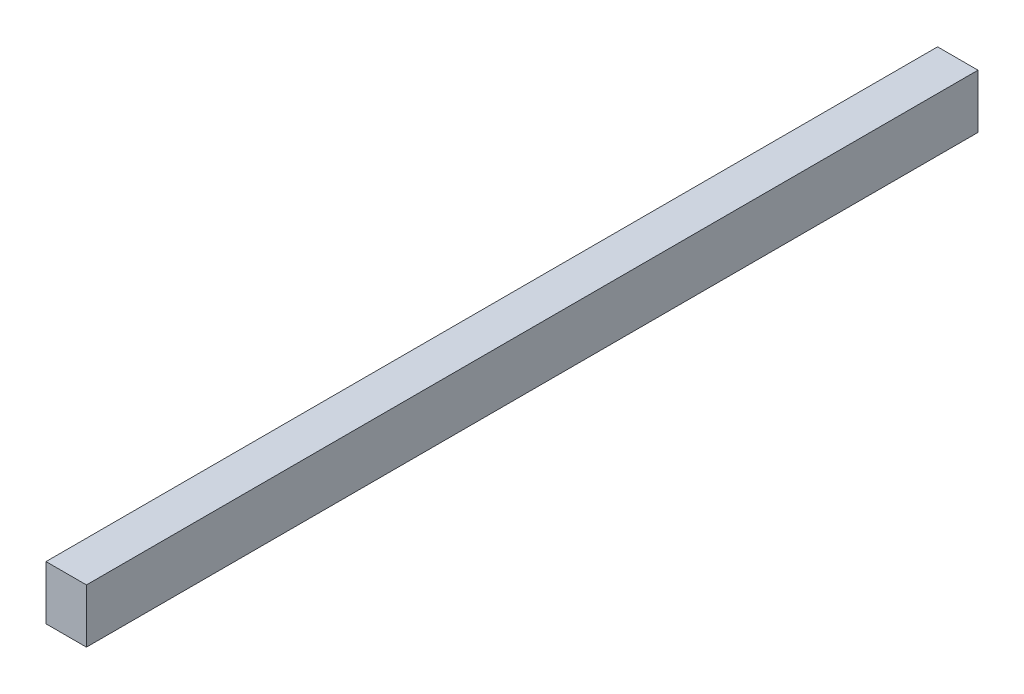
ISO-10303-21;
HEADER;
FILE_DESCRIPTION(('STEP AP214'),'2;1');
FILE_NAME('part.step','',(''),(''),'','','');
FILE_SCHEMA(('AUTOMOTIVE_DESIGN { 1 0 10303 214 1 1 1 1 }'));
ENDSEC;
DATA;
#1=APPLICATION_CONTEXT('core data for automotive mechanical design processes');
#2=APPLICATION_PROTOCOL_DEFINITION('international standard','automotive_design',2000,#1);
#3=PRODUCT_CONTEXT('',#1,'mechanical');
#4=PRODUCT('Part','Part','',(#3));
#5=PRODUCT_RELATED_PRODUCT_CATEGORY('part','',(#4));
#6=PRODUCT_DEFINITION_FORMATION('','',#4);
#7=PRODUCT_DEFINITION_CONTEXT('part definition',#1,'design');
#8=PRODUCT_DEFINITION('design','',#6,#7);
#9=PRODUCT_DEFINITION_SHAPE('','',#8);
#10=(LENGTH_UNIT() NAMED_UNIT(*) SI_UNIT(.MILLI.,.METRE.));
#11=(NAMED_UNIT(*) PLANE_ANGLE_UNIT() SI_UNIT($,.RADIAN.));
#12=(NAMED_UNIT(*) SI_UNIT($,.STERADIAN.) SOLID_ANGLE_UNIT());
#13=UNCERTAINTY_MEASURE_WITH_UNIT(LENGTH_MEASURE(1.E-05),#10,'distance_accuracy_value','');
#14=(GEOMETRIC_REPRESENTATION_CONTEXT(3) GLOBAL_UNCERTAINTY_ASSIGNED_CONTEXT((#13)) GLOBAL_UNIT_ASSIGNED_CONTEXT((#10,
#11,#12)) REPRESENTATION_CONTEXT('',''));
#15=CARTESIAN_POINT('',(0.,0.,0.));
#16=DIRECTION('',(0.,0.,1.));
#17=DIRECTION('',(1.,0.,0.));
#18=AXIS2_PLACEMENT_3D('',#15,#16,#17);
#19=CARTESIAN_POINT('',(0.,0.,1680.));
#20=DIRECTION('',(1.,0.,0.));
#21=DIRECTION('',(0.,0.,-1.));
#22=AXIS2_PLACEMENT_3D('',#19,#20,#21);
#23=PLANE('',#22);
#24=DIRECTION('',(0.,-1.,0.));
#25=VECTOR('',#24,1.);
#26=CARTESIAN_POINT('',(0.,0.,0.));
#27=LINE('',#26,#25);
#28=CARTESIAN_POINT('',(0.,101.6,0.));
#29=VERTEX_POINT('',#28);
#30=CARTESIAN_POINT('',(0.,0.,0.));
#31=VERTEX_POINT('',#30);
#32=EDGE_CURVE('E97',#29,#31,#27,.T.);
#33=ORIENTED_EDGE('',*,*,#32,.T.);
#34=DIRECTION('',(0.,0.,-1.));
#35=VECTOR('',#34,1.);
#36=CARTESIAN_POINT('',(0.,0.,1680.));
#37=LINE('',#36,#35);
#38=CARTESIAN_POINT('',(0.,0.,1680.));
#39=VERTEX_POINT('',#38);
#40=EDGE_CURVE('E11',#39,#31,#37,.T.);
#41=ORIENTED_EDGE('',*,*,#40,.F.);
#42=DIRECTION('',(0.,-1.,0.));
#43=VECTOR('',#42,1.);
#44=CARTESIAN_POINT('',(0.,0.,1680.));
#45=LINE('',#44,#43);
#46=CARTESIAN_POINT('',(0.,101.6,1680.));
#47=VERTEX_POINT('',#46);
#48=EDGE_CURVE('E85',#47,#39,#45,.T.);
#49=ORIENTED_EDGE('',*,*,#48,.F.);
#50=DIRECTION('',(0.,0.,-1.));
#51=VECTOR('',#50,1.);
#52=CARTESIAN_POINT('',(0.,101.6,1680.));
#53=LINE('',#52,#51);
#54=EDGE_CURVE('E93',#47,#29,#53,.T.);
#55=ORIENTED_EDGE('',*,*,#54,.T.);
#56=EDGE_LOOP('',(#33,#41,#49,#55));
#57=FACE_BOUND('',#56,.T.);
#58=ADVANCED_FACE('F34',(#57),#23,.F.);
#59=CARTESIAN_POINT('',(0.,0.,1680.));
#60=DIRECTION('',(0.,1.,0.));
#61=DIRECTION('',(0.,0.,1.));
#62=AXIS2_PLACEMENT_3D('',#59,#60,#61);
#63=PLANE('',#62);
#64=DIRECTION('',(1.,0.,0.));
#65=VECTOR('',#64,1.);
#66=CARTESIAN_POINT('',(0.,0.,0.));
#67=LINE('',#66,#65);
#68=CARTESIAN_POINT('',(76.2,0.,0.));
#69=VERTEX_POINT('',#68);
#70=EDGE_CURVE('E89',#31,#69,#67,.T.);
#71=ORIENTED_EDGE('',*,*,#70,.T.);
#72=DIRECTION('',(0.,0.,-1.));
#73=VECTOR('',#72,1.);
#74=CARTESIAN_POINT('',(76.2,0.,1680.));
#75=LINE('',#74,#73);
#76=CARTESIAN_POINT('',(76.2,0.,1680.));
#77=VERTEX_POINT('',#76);
#78=EDGE_CURVE('E42',#77,#69,#75,.T.);
#79=ORIENTED_EDGE('',*,*,#78,.F.);
#80=DIRECTION('',(1.,0.,0.));
#81=VECTOR('',#80,1.);
#82=CARTESIAN_POINT('',(0.,0.,1680.));
#83=LINE('',#82,#81);
#84=EDGE_CURVE('E80',#39,#77,#83,.T.);
#85=ORIENTED_EDGE('',*,*,#84,.F.);
#86=ORIENTED_EDGE('',*,*,#40,.T.);
#87=EDGE_LOOP('',(#71,#79,#85,#86));
#88=FACE_BOUND('',#87,.T.);
#89=ADVANCED_FACE('F88',(#88),#63,.F.);
#90=CARTESIAN_POINT('',(76.2,0.,1680.));
#91=DIRECTION('',(-1.,0.,0.));
#92=DIRECTION('',(0.,0.,1.));
#93=AXIS2_PLACEMENT_3D('',#90,#91,#92);
#94=PLANE('',#93);
#95=DIRECTION('',(0.,1.,0.));
#96=VECTOR('',#95,1.);
#97=CARTESIAN_POINT('',(76.2,0.,0.));
#98=LINE('',#97,#96);
#99=CARTESIAN_POINT('',(76.2,101.6,0.));
#100=VERTEX_POINT('',#99);
#101=EDGE_CURVE('E67',#69,#100,#98,.T.);
#102=ORIENTED_EDGE('',*,*,#101,.T.);
#103=DIRECTION('',(0.,0.,-1.));
#104=VECTOR('',#103,1.);
#105=CARTESIAN_POINT('',(76.2,101.6,1680.));
#106=LINE('',#105,#104);
#107=CARTESIAN_POINT('',(76.2,101.6,1680.));
#108=VERTEX_POINT('',#107);
#109=EDGE_CURVE('E90',#108,#100,#106,.T.);
#110=ORIENTED_EDGE('',*,*,#109,.F.);
#111=DIRECTION('',(0.,1.,0.));
#112=VECTOR('',#111,1.);
#113=CARTESIAN_POINT('',(76.2,0.,1680.));
#114=LINE('',#113,#112);
#115=EDGE_CURVE('E83',#77,#108,#114,.T.);
#116=ORIENTED_EDGE('',*,*,#115,.F.);
#117=ORIENTED_EDGE('',*,*,#78,.T.);
#118=EDGE_LOOP('',(#102,#110,#116,#117));
#119=FACE_BOUND('',#118,.T.);
#120=ADVANCED_FACE('F91',(#119),#94,.F.);
#121=CARTESIAN_POINT('',(0.,101.6,1680.));
#122=DIRECTION('',(0.,-1.,0.));
#123=DIRECTION('',(0.,0.,-1.));
#124=AXIS2_PLACEMENT_3D('',#121,#122,#123);
#125=PLANE('',#124);
#126=DIRECTION('',(-1.,0.,0.));
#127=VECTOR('',#126,1.);
#128=CARTESIAN_POINT('',(0.,101.6,0.));
#129=LINE('',#128,#127);
#130=EDGE_CURVE('E73',#100,#29,#129,.T.);
#131=ORIENTED_EDGE('',*,*,#130,.T.);
#132=ORIENTED_EDGE('',*,*,#54,.F.);
#133=DIRECTION('',(-1.,0.,0.));
#134=VECTOR('',#133,1.);
#135=CARTESIAN_POINT('',(0.,101.6,1680.));
#136=LINE('',#135,#134);
#137=EDGE_CURVE('E50',#108,#47,#136,.T.);
#138=ORIENTED_EDGE('',*,*,#137,.F.);
#139=ORIENTED_EDGE('',*,*,#109,.T.);
#140=EDGE_LOOP('',(#131,#132,#138,#139));
#141=FACE_BOUND('',#140,.T.);
#142=ADVANCED_FACE('F104',(#141),#125,.F.);
#143=CARTESIAN_POINT('',(0.,0.,1680.));
#144=DIRECTION('',(0.,0.,-1.));
#145=DIRECTION('',(-1.,0.,0.));
#146=AXIS2_PLACEMENT_3D('',#143,#144,#145);
#147=PLANE('',#146);
#148=ORIENTED_EDGE('',*,*,#48,.T.);
#149=ORIENTED_EDGE('',*,*,#84,.T.);
#150=ORIENTED_EDGE('',*,*,#115,.T.);
#151=ORIENTED_EDGE('',*,*,#137,.T.);
#152=EDGE_LOOP('',(#148,#149,#150,#151));
#153=FACE_BOUND('',#152,.T.);
#154=ADVANCED_FACE('F81',(#153),#147,.F.);
#155=CARTESIAN_POINT('',(0.,0.,0.));
#156=DIRECTION('',(0.,0.,-1.));
#157=DIRECTION('',(-1.,0.,0.));
#158=AXIS2_PLACEMENT_3D('',#155,#156,#157);
#159=PLANE('',#158);
#160=ORIENTED_EDGE('',*,*,#32,.F.);
#161=ORIENTED_EDGE('',*,*,#130,.F.);
#162=ORIENTED_EDGE('',*,*,#101,.F.);
#163=ORIENTED_EDGE('',*,*,#70,.F.);
#164=EDGE_LOOP('',(#160,#161,#162,#163));
#165=FACE_BOUND('',#164,.T.);
#166=ADVANCED_FACE('F107',(#165),#159,.T.);
#167=CLOSED_SHELL('',(#58,#89,#120,#142,#154,#166));
#168=MANIFOLD_SOLID_BREP('B2',#167);
#169=ADVANCED_BREP_SHAPE_REPRESENTATION('',(#18,#168),#14);
#170=SHAPE_DEFINITION_REPRESENTATION(#9,#169);
ENDSEC;
END-ISO-10303-21;
